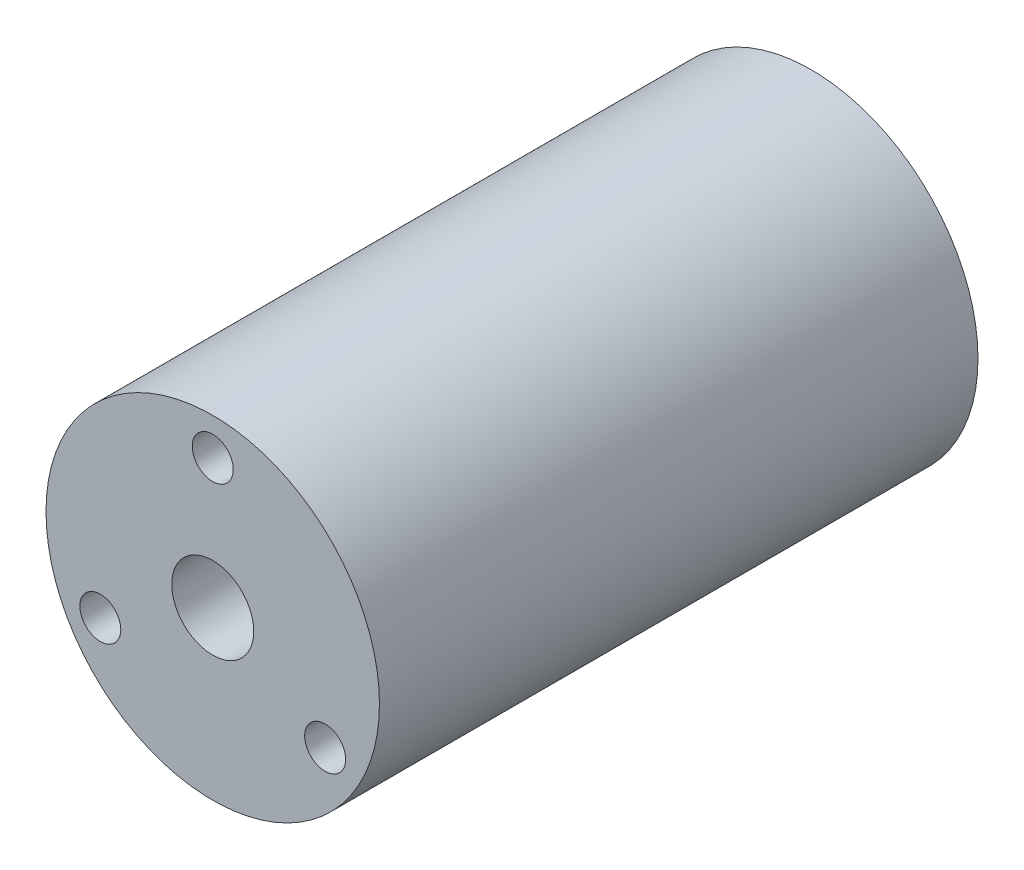
ISO-10303-21;
HEADER;
FILE_DESCRIPTION(('STEP AP214'),'2;1');
FILE_NAME('part.step','',(''),(''),'','','');
FILE_SCHEMA(('AUTOMOTIVE_DESIGN { 1 0 10303 214 1 1 1 1 }'));
ENDSEC;
DATA;
#1=APPLICATION_CONTEXT('core data for automotive mechanical design processes');
#2=APPLICATION_PROTOCOL_DEFINITION('international standard','automotive_design',2000,#1);
#3=PRODUCT_CONTEXT('',#1,'mechanical');
#4=PRODUCT('Part','Part','',(#3));
#5=PRODUCT_RELATED_PRODUCT_CATEGORY('part','',(#4));
#6=PRODUCT_DEFINITION_FORMATION('','',#4);
#7=PRODUCT_DEFINITION_CONTEXT('part definition',#1,'design');
#8=PRODUCT_DEFINITION('design','',#6,#7);
#9=PRODUCT_DEFINITION_SHAPE('','',#8);
#10=(LENGTH_UNIT() NAMED_UNIT(*) SI_UNIT(.MILLI.,.METRE.));
#11=(NAMED_UNIT(*) PLANE_ANGLE_UNIT() SI_UNIT($,.RADIAN.));
#12=(NAMED_UNIT(*) SI_UNIT($,.STERADIAN.) SOLID_ANGLE_UNIT());
#13=UNCERTAINTY_MEASURE_WITH_UNIT(LENGTH_MEASURE(1.E-05),#10,'distance_accuracy_value','');
#14=(GEOMETRIC_REPRESENTATION_CONTEXT(3) GLOBAL_UNCERTAINTY_ASSIGNED_CONTEXT((#13)) GLOBAL_UNIT_ASSIGNED_CONTEXT((#10,
#11,#12)) REPRESENTATION_CONTEXT('',''));
#15=CARTESIAN_POINT('',(0.,0.,0.));
#16=DIRECTION('',(0.,0.,1.));
#17=DIRECTION('',(1.,0.,0.));
#18=AXIS2_PLACEMENT_3D('',#15,#16,#17);
#19=CARTESIAN_POINT('',(0.,0.,-43.8));
#20=DIRECTION('',(0.,0.,1.));
#21=DIRECTION('',(1.,0.,0.));
#22=AXIS2_PLACEMENT_3D('',#19,#20,#21);
#23=CYLINDRICAL_SURFACE('',#22,12.2);
#24=CARTESIAN_POINT('',(0.,0.,-43.8));
#25=DIRECTION('',(0.,0.,1.));
#26=DIRECTION('',(1.,0.,0.));
#27=AXIS2_PLACEMENT_3D('',#24,#25,#26);
#28=CIRCLE('',#27,12.2);
#29=CARTESIAN_POINT('',(12.2,0.,-43.8));
#30=VERTEX_POINT('',#29);
#31=EDGE_CURVE('E10',#30,#30,#28,.T.);
#32=ORIENTED_EDGE('',*,*,#31,.T.);
#33=EDGE_LOOP('',(#32));
#34=FACE_BOUND('',#33,.T.);
#35=CARTESIAN_POINT('',(0.,0.,0.));
#36=DIRECTION('',(0.,0.,1.));
#37=DIRECTION('',(1.,0.,0.));
#38=AXIS2_PLACEMENT_3D('',#35,#36,#37);
#39=CIRCLE('',#38,12.2);
#40=CARTESIAN_POINT('',(12.2,0.,0.));
#41=VERTEX_POINT('',#40);
#42=EDGE_CURVE('E35',#41,#41,#39,.T.);
#43=ORIENTED_EDGE('',*,*,#42,.F.);
#44=EDGE_LOOP('',(#43));
#45=FACE_BOUND('',#44,.T.);
#46=ADVANCED_FACE('F32',(#34,#45),#23,.T.);
#47=CARTESIAN_POINT('',(0.,0.,-43.8));
#48=DIRECTION('',(0.,0.,1.));
#49=DIRECTION('',(1.,0.,0.));
#50=AXIS2_PLACEMENT_3D('',#47,#48,#49);
#51=PLANE('',#50);
#52=CARTESIAN_POINT('',(0.,0.,-43.8));
#53=DIRECTION('',(0.,0.,1.));
#54=DIRECTION('',(1.,0.,0.));
#55=AXIS2_PLACEMENT_3D('',#52,#53,#54);
#56=CIRCLE('',#55,3.);
#57=CARTESIAN_POINT('',(3.,0.,-43.8));
#58=VERTEX_POINT('',#57);
#59=EDGE_CURVE('E42',#58,#58,#56,.T.);
#60=ORIENTED_EDGE('',*,*,#59,.T.);
#61=EDGE_LOOP('',(#60));
#62=FACE_BOUND('',#61,.T.);
#63=ORIENTED_EDGE('',*,*,#31,.F.);
#64=EDGE_LOOP('',(#63));
#65=FACE_BOUND('',#64,.T.);
#66=ADVANCED_FACE('F81',(#62,#65),#51,.F.);
#67=CARTESIAN_POINT('',(0.,0.,0.));
#68=DIRECTION('',(0.,0.,1.));
#69=DIRECTION('',(1.,0.,0.));
#70=AXIS2_PLACEMENT_3D('',#67,#68,#69);
#71=PLANE('',#70);
#72=CARTESIAN_POINT('',(8.22724133595221,-4.74999999999992,0.));
#73=DIRECTION('',(0.,0.,1.));
#74=DIRECTION('',(-0.499999999999992,-0.866025403784443,0.));
#75=AXIS2_PLACEMENT_3D('',#72,#73,#74);
#76=CIRCLE('',#75,1.5);
#77=CARTESIAN_POINT('',(7.47724133595222,-6.04903810567659,0.));
#78=VERTEX_POINT('',#77);
#79=EDGE_CURVE('E62',#78,#78,#76,.T.);
#80=ORIENTED_EDGE('',*,*,#79,.F.);
#81=EDGE_LOOP('',(#80));
#82=FACE_BOUND('',#81,.T.);
#83=CARTESIAN_POINT('',(-8.22724133595215,-4.75000000000004,0.));
#84=DIRECTION('',(0.,0.,1.));
#85=DIRECTION('',(-0.500000000000004,0.866025403784436,0.));
#86=AXIS2_PLACEMENT_3D('',#83,#84,#85);
#87=CIRCLE('',#86,1.5);
#88=CARTESIAN_POINT('',(-8.97724133595215,-3.45096189432338,0.));
#89=VERTEX_POINT('',#88);
#90=EDGE_CURVE('E56',#89,#89,#87,.T.);
#91=ORIENTED_EDGE('',*,*,#90,.F.);
#92=EDGE_LOOP('',(#91));
#93=FACE_BOUND('',#92,.T.);
#94=CARTESIAN_POINT('',(0.,9.5,0.));
#95=DIRECTION('',(0.,0.,1.));
#96=DIRECTION('',(1.,0.,0.));
#97=AXIS2_PLACEMENT_3D('',#94,#95,#96);
#98=CIRCLE('',#97,1.5);
#99=CARTESIAN_POINT('',(1.5,9.5,0.));
#100=VERTEX_POINT('',#99);
#101=EDGE_CURVE('E50',#100,#100,#98,.T.);
#102=ORIENTED_EDGE('',*,*,#101,.F.);
#103=EDGE_LOOP('',(#102));
#104=FACE_BOUND('',#103,.T.);
#105=CARTESIAN_POINT('',(0.,0.,0.));
#106=DIRECTION('',(0.,0.,1.));
#107=DIRECTION('',(1.,0.,0.));
#108=AXIS2_PLACEMENT_3D('',#105,#106,#107);
#109=CIRCLE('',#108,3.);
#110=CARTESIAN_POINT('',(3.,0.,0.));
#111=VERTEX_POINT('',#110);
#112=EDGE_CURVE('E44',#111,#111,#109,.T.);
#113=ORIENTED_EDGE('',*,*,#112,.F.);
#114=EDGE_LOOP('',(#113));
#115=FACE_BOUND('',#114,.T.);
#116=ORIENTED_EDGE('',*,*,#42,.T.);
#117=EDGE_LOOP('',(#116));
#118=FACE_BOUND('',#117,.T.);
#119=ADVANCED_FACE('F77',(#82,#93,#104,#115,#118),#71,.T.);
#120=CARTESIAN_POINT('',(0.,0.,-43.8));
#121=DIRECTION('',(0.,0.,1.));
#122=DIRECTION('',(1.,0.,0.));
#123=AXIS2_PLACEMENT_3D('',#120,#121,#122);
#124=CYLINDRICAL_SURFACE('',#123,3.);
#125=ORIENTED_EDGE('',*,*,#59,.F.);
#126=EDGE_LOOP('',(#125));
#127=FACE_BOUND('',#126,.T.);
#128=ORIENTED_EDGE('',*,*,#112,.T.);
#129=EDGE_LOOP('',(#128));
#130=FACE_BOUND('',#129,.T.);
#131=ADVANCED_FACE('F80',(#127,#130),#124,.F.);
#132=CARTESIAN_POINT('',(0.,9.5,-5.5));
#133=DIRECTION('',(0.,0.,1.));
#134=DIRECTION('',(1.,0.,0.));
#135=AXIS2_PLACEMENT_3D('',#132,#133,#134);
#136=CYLINDRICAL_SURFACE('',#135,1.5);
#137=CARTESIAN_POINT('',(0.,9.5,-5.5));
#138=DIRECTION('',(0.,0.,1.));
#139=DIRECTION('',(1.,0.,0.));
#140=AXIS2_PLACEMENT_3D('',#137,#138,#139);
#141=CIRCLE('',#140,1.5);
#142=CARTESIAN_POINT('',(1.5,9.5,-5.5));
#143=VERTEX_POINT('',#142);
#144=EDGE_CURVE('E47',#143,#143,#141,.T.);
#145=ORIENTED_EDGE('',*,*,#144,.F.);
#146=EDGE_LOOP('',(#145));
#147=FACE_BOUND('',#146,.T.);
#148=ORIENTED_EDGE('',*,*,#101,.T.);
#149=EDGE_LOOP('',(#148));
#150=FACE_BOUND('',#149,.T.);
#151=ADVANCED_FACE('F102',(#147,#150),#136,.F.);
#152=CARTESIAN_POINT('',(0.,9.5,-5.5));
#153=DIRECTION('',(0.,0.,1.));
#154=DIRECTION('',(1.,0.,0.));
#155=AXIS2_PLACEMENT_3D('',#152,#153,#154);
#156=PLANE('',#155);
#157=ORIENTED_EDGE('',*,*,#144,.T.);
#158=EDGE_LOOP('',(#157));
#159=FACE_BOUND('',#158,.T.);
#160=ADVANCED_FACE('F106',(#159),#156,.T.);
#161=CARTESIAN_POINT('',(-8.22724133595215,-4.75000000000004,-5.5));
#162=DIRECTION('',(0.,0.,1.));
#163=DIRECTION('',(1.,0.,0.));
#164=AXIS2_PLACEMENT_3D('',#161,#162,#163);
#165=CYLINDRICAL_SURFACE('',#164,1.5);
#166=CARTESIAN_POINT('',(-8.22724133595215,-4.75000000000004,-5.5));
#167=DIRECTION('',(0.,0.,1.));
#168=DIRECTION('',(-0.500000000000004,0.866025403784436,0.));
#169=AXIS2_PLACEMENT_3D('',#166,#167,#168);
#170=CIRCLE('',#169,1.5);
#171=CARTESIAN_POINT('',(-8.97724133595215,-3.45096189432338,-5.5));
#172=VERTEX_POINT('',#171);
#173=EDGE_CURVE('E53',#172,#172,#170,.T.);
#174=ORIENTED_EDGE('',*,*,#173,.F.);
#175=EDGE_LOOP('',(#174));
#176=FACE_BOUND('',#175,.T.);
#177=ORIENTED_EDGE('',*,*,#90,.T.);
#178=EDGE_LOOP('',(#177));
#179=FACE_BOUND('',#178,.T.);
#180=ADVANCED_FACE('F110',(#176,#179),#165,.F.);
#181=CARTESIAN_POINT('',(-8.22724133595215,-4.75000000000004,-5.5));
#182=DIRECTION('',(0.,0.,1.));
#183=DIRECTION('',(-0.500000000000004,0.866025403784436,0.));
#184=AXIS2_PLACEMENT_3D('',#181,#182,#183);
#185=PLANE('',#184);
#186=ORIENTED_EDGE('',*,*,#173,.T.);
#187=EDGE_LOOP('',(#186));
#188=FACE_BOUND('',#187,.T.);
#189=ADVANCED_FACE('F73',(#188),#185,.T.);
#190=CARTESIAN_POINT('',(8.22724133595221,-4.74999999999992,-5.5));
#191=DIRECTION('',(0.,0.,1.));
#192=DIRECTION('',(1.,0.,0.));
#193=AXIS2_PLACEMENT_3D('',#190,#191,#192);
#194=CYLINDRICAL_SURFACE('',#193,1.5);
#195=CARTESIAN_POINT('',(8.22724133595221,-4.74999999999992,-5.5));
#196=DIRECTION('',(0.,0.,1.));
#197=DIRECTION('',(-0.499999999999992,-0.866025403784443,0.));
#198=AXIS2_PLACEMENT_3D('',#195,#196,#197);
#199=CIRCLE('',#198,1.5);
#200=CARTESIAN_POINT('',(7.47724133595222,-6.04903810567659,-5.5));
#201=VERTEX_POINT('',#200);
#202=EDGE_CURVE('E59',#201,#201,#199,.T.);
#203=ORIENTED_EDGE('',*,*,#202,.F.);
#204=EDGE_LOOP('',(#203));
#205=FACE_BOUND('',#204,.T.);
#206=ORIENTED_EDGE('',*,*,#79,.T.);
#207=EDGE_LOOP('',(#206));
#208=FACE_BOUND('',#207,.T.);
#209=ADVANCED_FACE('F70',(#205,#208),#194,.F.);
#210=CARTESIAN_POINT('',(8.22724133595221,-4.74999999999992,-5.5));
#211=DIRECTION('',(0.,0.,1.));
#212=DIRECTION('',(-0.499999999999992,-0.866025403784443,0.));
#213=AXIS2_PLACEMENT_3D('',#210,#211,#212);
#214=PLANE('',#213);
#215=ORIENTED_EDGE('',*,*,#202,.T.);
#216=EDGE_LOOP('',(#215));
#217=FACE_BOUND('',#216,.T.);
#218=ADVANCED_FACE('F68',(#217),#214,.T.);
#219=CLOSED_SHELL('',(#46,#66,#119,#131,#151,#160,#180,#189,#209,#218));
#220=MANIFOLD_SOLID_BREP('B2',#219);
#221=ADVANCED_BREP_SHAPE_REPRESENTATION('',(#18,#220),#14);
#222=SHAPE_DEFINITION_REPRESENTATION(#9,#221);
ENDSEC;
END-ISO-10303-21;
